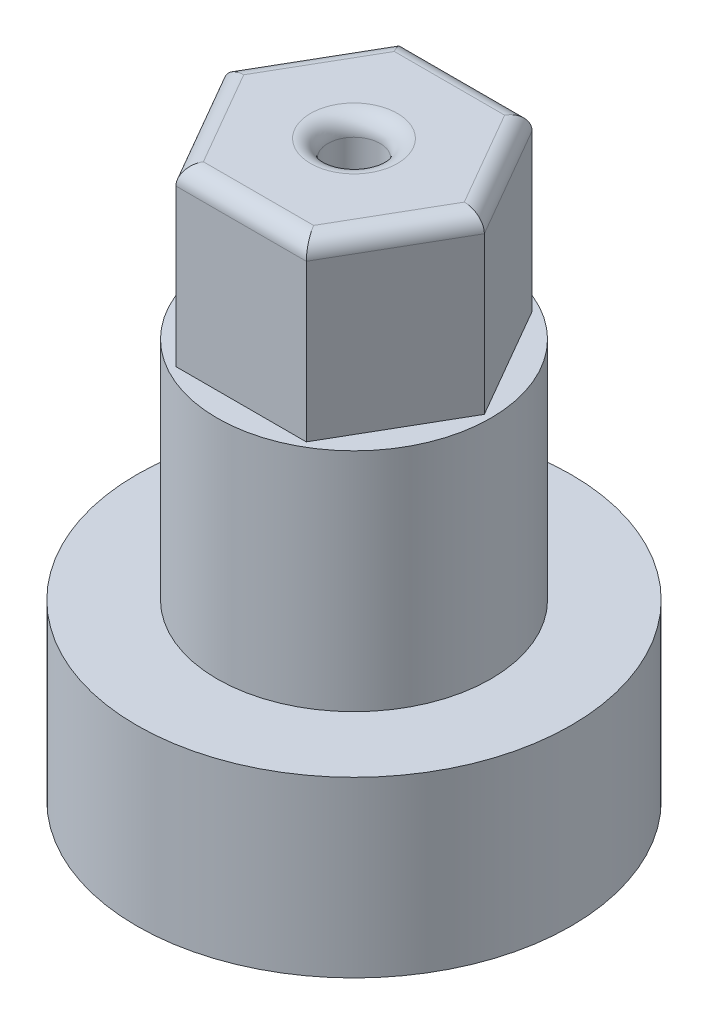
ISO-10303-21;
HEADER;
FILE_DESCRIPTION(('STEP AP214'),'2;1');
FILE_NAME('part.step','',(''),(''),'','','');
FILE_SCHEMA(('AUTOMOTIVE_DESIGN { 1 0 10303 214 1 1 1 1 }'));
ENDSEC;
DATA;
#1=APPLICATION_CONTEXT('core data for automotive mechanical design processes');
#2=APPLICATION_PROTOCOL_DEFINITION('international standard','automotive_design',2000,#1);
#3=PRODUCT_CONTEXT('',#1,'mechanical');
#4=PRODUCT('Part','Part','',(#3));
#5=PRODUCT_RELATED_PRODUCT_CATEGORY('part','',(#4));
#6=PRODUCT_DEFINITION_FORMATION('','',#4);
#7=PRODUCT_DEFINITION_CONTEXT('part definition',#1,'design');
#8=PRODUCT_DEFINITION('design','',#6,#7);
#9=PRODUCT_DEFINITION_SHAPE('','',#8);
#10=(LENGTH_UNIT() NAMED_UNIT(*) SI_UNIT(.MILLI.,.METRE.));
#11=(NAMED_UNIT(*) PLANE_ANGLE_UNIT() SI_UNIT($,.RADIAN.));
#12=(NAMED_UNIT(*) SI_UNIT($,.STERADIAN.) SOLID_ANGLE_UNIT());
#13=UNCERTAINTY_MEASURE_WITH_UNIT(LENGTH_MEASURE(1.E-05),#10,'distance_accuracy_value','');
#14=(GEOMETRIC_REPRESENTATION_CONTEXT(3) GLOBAL_UNCERTAINTY_ASSIGNED_CONTEXT((#13)) GLOBAL_UNIT_ASSIGNED_CONTEXT((#10,
#11,#12)) REPRESENTATION_CONTEXT('',''));
#15=CARTESIAN_POINT('',(0.,0.,0.));
#16=DIRECTION('',(0.,0.,1.));
#17=DIRECTION('',(1.,0.,0.));
#18=AXIS2_PLACEMENT_3D('',#15,#16,#17);
#19=CARTESIAN_POINT('',(0.,10.,0.));
#20=DIRECTION('',(0.,1.,0.));
#21=DIRECTION('',(0.,0.,1.));
#22=AXIS2_PLACEMENT_3D('',#19,#20,#21);
#23=PLANE('',#22);
#24=CARTESIAN_POINT('',(0.,10.,0.));
#25=DIRECTION('',(0.,1.,0.));
#26=DIRECTION('',(0.,0.,1.));
#27=AXIS2_PLACEMENT_3D('',#24,#25,#26);
#28=CIRCLE('',#27,7.875);
#29=CARTESIAN_POINT('',(0.,10.,-7.875));
#30=VERTEX_POINT('',#29);
#31=EDGE_CURVE('E148',#30,#30,#28,.T.);
#32=ORIENTED_EDGE('',*,*,#31,.F.);
#33=EDGE_LOOP('',(#32));
#34=FACE_BOUND('',#33,.T.);
#35=CARTESIAN_POINT('',(0.,10.,0.));
#36=DIRECTION('',(0.,1.,0.));
#37=DIRECTION('',(0.,0.,1.));
#38=AXIS2_PLACEMENT_3D('',#35,#36,#37);
#39=CIRCLE('',#38,12.5);
#40=CARTESIAN_POINT('',(0.,10.,12.5));
#41=VERTEX_POINT('',#40);
#42=EDGE_CURVE('E179',#41,#41,#39,.T.);
#43=ORIENTED_EDGE('',*,*,#42,.T.);
#44=EDGE_LOOP('',(#43));
#45=FACE_BOUND('',#44,.T.);
#46=ADVANCED_FACE('F33',(#34,#45),#23,.T.);
#47=CARTESIAN_POINT('',(0.,0.,0.));
#48=DIRECTION('',(0.,1.,0.));
#49=DIRECTION('',(0.,0.,1.));
#50=AXIS2_PLACEMENT_3D('',#47,#48,#49);
#51=PLANE('',#50);
#52=CARTESIAN_POINT('',(0.,0.,0.));
#53=DIRECTION('',(0.,1.,0.));
#54=DIRECTION('',(0.,0.,1.));
#55=AXIS2_PLACEMENT_3D('',#52,#53,#54);
#56=CIRCLE('',#55,1.5);
#57=CARTESIAN_POINT('',(0.,0.,1.5));
#58=VERTEX_POINT('',#57);
#59=EDGE_CURVE('E129',#58,#58,#56,.T.);
#60=ORIENTED_EDGE('',*,*,#59,.T.);
#61=EDGE_LOOP('',(#60));
#62=FACE_BOUND('',#61,.T.);
#63=CARTESIAN_POINT('',(0.,0.,0.));
#64=DIRECTION('',(0.,1.,0.));
#65=DIRECTION('',(0.,0.,1.));
#66=AXIS2_PLACEMENT_3D('',#63,#64,#65);
#67=CIRCLE('',#66,12.5);
#68=CARTESIAN_POINT('',(0.,0.,12.5));
#69=VERTEX_POINT('',#68);
#70=EDGE_CURVE('E178',#69,#69,#67,.T.);
#71=ORIENTED_EDGE('',*,*,#70,.F.);
#72=EDGE_LOOP('',(#71));
#73=FACE_BOUND('',#72,.T.);
#74=CARTESIAN_POINT('',(7.,0.,0.));
#75=DIRECTION('',(0.,1.,0.));
#76=DIRECTION('',(0.,0.,1.));
#77=AXIS2_PLACEMENT_3D('',#74,#75,#76);
#78=CIRCLE('',#77,0.750000000000001);
#79=CARTESIAN_POINT('',(7.,0.,0.750000000000001));
#80=VERTEX_POINT('',#79);
#81=EDGE_CURVE('E175',#80,#80,#78,.T.);
#82=ORIENTED_EDGE('',*,*,#81,.T.);
#83=EDGE_LOOP('',(#82));
#84=FACE_BOUND('',#83,.T.);
#85=CARTESIAN_POINT('',(0.,0.,7.));
#86=DIRECTION('',(0.,1.,0.));
#87=DIRECTION('',(0.,0.,1.));
#88=AXIS2_PLACEMENT_3D('',#85,#86,#87);
#89=CIRCLE('',#88,0.750000000000001);
#90=CARTESIAN_POINT('',(0.,0.,7.75));
#91=VERTEX_POINT('',#90);
#92=EDGE_CURVE('E172',#91,#91,#89,.T.);
#93=ORIENTED_EDGE('',*,*,#92,.T.);
#94=EDGE_LOOP('',(#93));
#95=FACE_BOUND('',#94,.T.);
#96=CARTESIAN_POINT('',(-7.,0.,0.));
#97=DIRECTION('',(0.,1.,0.));
#98=DIRECTION('',(0.,0.,1.));
#99=AXIS2_PLACEMENT_3D('',#96,#97,#98);
#100=CIRCLE('',#99,0.750000000000001);
#101=CARTESIAN_POINT('',(-7.,0.,0.749999999999952));
#102=VERTEX_POINT('',#101);
#103=EDGE_CURVE('E169',#102,#102,#100,.T.);
#104=ORIENTED_EDGE('',*,*,#103,.T.);
#105=EDGE_LOOP('',(#104));
#106=FACE_BOUND('',#105,.T.);
#107=CARTESIAN_POINT('',(0.,0.,-7.));
#108=DIRECTION('',(0.,1.,0.));
#109=DIRECTION('',(0.,0.,1.));
#110=AXIS2_PLACEMENT_3D('',#107,#108,#109);
#111=CIRCLE('',#110,0.750000000000002);
#112=CARTESIAN_POINT('',(0.,0.,-6.25));
#113=VERTEX_POINT('',#112);
#114=EDGE_CURVE('E166',#113,#113,#111,.T.);
#115=ORIENTED_EDGE('',*,*,#114,.T.);
#116=EDGE_LOOP('',(#115));
#117=FACE_BOUND('',#116,.T.);
#118=ADVANCED_FACE('F231',(#62,#73,#84,#95,#106,#117),#51,.F.);
#119=CARTESIAN_POINT('',(0.,10.,0.));
#120=DIRECTION('',(0.,-1.,0.));
#121=DIRECTION('',(0.,0.,-1.));
#122=AXIS2_PLACEMENT_3D('',#119,#120,#121);
#123=CYLINDRICAL_SURFACE('',#122,12.5);
#124=ORIENTED_EDGE('',*,*,#42,.F.);
#125=EDGE_LOOP('',(#124));
#126=FACE_BOUND('',#125,.T.);
#127=ORIENTED_EDGE('',*,*,#70,.T.);
#128=EDGE_LOOP('',(#127));
#129=FACE_BOUND('',#128,.T.);
#130=ADVANCED_FACE('F255',(#126,#129),#123,.T.);
#131=CARTESIAN_POINT('',(7.,10.,0.));
#132=DIRECTION('',(0.,-1.,0.));
#133=DIRECTION('',(0.,0.,-1.));
#134=AXIS2_PLACEMENT_3D('',#131,#132,#133);
#135=CYLINDRICAL_SURFACE('',#134,0.750000000000001);
#136=CARTESIAN_POINT('',(7.,10.,0.));
#137=DIRECTION('',(0.,1.,0.));
#138=DIRECTION('',(0.,0.,1.));
#139=AXIS2_PLACEMENT_3D('',#136,#137,#138);
#140=CIRCLE('',#139,0.750000000000001);
#141=CARTESIAN_POINT('',(7.,10.,0.750000000000001));
#142=VERTEX_POINT('',#141);
#143=EDGE_CURVE('E163',#142,#142,#140,.T.);
#144=ORIENTED_EDGE('',*,*,#143,.T.);
#145=EDGE_LOOP('',(#144));
#146=FACE_BOUND('',#145,.T.);
#147=ORIENTED_EDGE('',*,*,#81,.F.);
#148=EDGE_LOOP('',(#147));
#149=FACE_BOUND('',#148,.T.);
#150=ADVANCED_FACE('F260',(#146,#149),#135,.F.);
#151=CARTESIAN_POINT('',(0.,10.,7.));
#152=DIRECTION('',(0.,-1.,0.));
#153=DIRECTION('',(0.,0.,-1.));
#154=AXIS2_PLACEMENT_3D('',#151,#152,#153);
#155=CYLINDRICAL_SURFACE('',#154,0.750000000000001);
#156=CARTESIAN_POINT('',(0.,10.,7.));
#157=DIRECTION('',(0.,1.,0.));
#158=DIRECTION('',(0.,0.,1.));
#159=AXIS2_PLACEMENT_3D('',#156,#157,#158);
#160=CIRCLE('',#159,0.750000000000001);
#161=CARTESIAN_POINT('',(0.,10.,7.75));
#162=VERTEX_POINT('',#161);
#163=EDGE_CURVE('E160',#162,#162,#160,.T.);
#164=ORIENTED_EDGE('',*,*,#163,.T.);
#165=EDGE_LOOP('',(#164));
#166=FACE_BOUND('',#165,.T.);
#167=ORIENTED_EDGE('',*,*,#92,.F.);
#168=EDGE_LOOP('',(#167));
#169=FACE_BOUND('',#168,.T.);
#170=ADVANCED_FACE('F450',(#166,#169),#155,.F.);
#171=CARTESIAN_POINT('',(-7.,10.,0.));
#172=DIRECTION('',(0.,-1.,0.));
#173=DIRECTION('',(0.,0.,-1.));
#174=AXIS2_PLACEMENT_3D('',#171,#172,#173);
#175=CYLINDRICAL_SURFACE('',#174,0.750000000000001);
#176=CARTESIAN_POINT('',(-7.,10.,0.));
#177=DIRECTION('',(0.,1.,0.));
#178=DIRECTION('',(0.,0.,1.));
#179=AXIS2_PLACEMENT_3D('',#176,#177,#178);
#180=CIRCLE('',#179,0.750000000000001);
#181=CARTESIAN_POINT('',(-7.,10.,0.749999999999952));
#182=VERTEX_POINT('',#181);
#183=EDGE_CURVE('E157',#182,#182,#180,.T.);
#184=ORIENTED_EDGE('',*,*,#183,.T.);
#185=EDGE_LOOP('',(#184));
#186=FACE_BOUND('',#185,.T.);
#187=ORIENTED_EDGE('',*,*,#103,.F.);
#188=EDGE_LOOP('',(#187));
#189=FACE_BOUND('',#188,.T.);
#190=ADVANCED_FACE('F441',(#186,#189),#175,.F.);
#191=CARTESIAN_POINT('',(0.,10.,-7.));
#192=DIRECTION('',(0.,-1.,0.));
#193=DIRECTION('',(0.,0.,-1.));
#194=AXIS2_PLACEMENT_3D('',#191,#192,#193);
#195=CYLINDRICAL_SURFACE('',#194,0.750000000000002);
#196=CARTESIAN_POINT('',(0.,10.,-7.));
#197=DIRECTION('',(0.,1.,0.));
#198=DIRECTION('',(0.,0.,1.));
#199=AXIS2_PLACEMENT_3D('',#196,#197,#198);
#200=CIRCLE('',#199,0.750000000000002);
#201=CARTESIAN_POINT('',(0.,10.,-6.25));
#202=VERTEX_POINT('',#201);
#203=EDGE_CURVE('E152',#202,#202,#200,.T.);
#204=ORIENTED_EDGE('',*,*,#203,.T.);
#205=EDGE_LOOP('',(#204));
#206=FACE_BOUND('',#205,.T.);
#207=ORIENTED_EDGE('',*,*,#114,.F.);
#208=EDGE_LOOP('',(#207));
#209=FACE_BOUND('',#208,.T.);
#210=ADVANCED_FACE('F433',(#206,#209),#195,.F.);
#211=CARTESIAN_POINT('',(0.,10.,0.));
#212=DIRECTION('',(0.,1.,0.));
#213=DIRECTION('',(0.,0.,1.));
#214=AXIS2_PLACEMENT_3D('',#211,#212,#213);
#215=PLANE('',#214);
#216=ORIENTED_EDGE('',*,*,#203,.F.);
#217=EDGE_LOOP('',(#216));
#218=FACE_BOUND('',#217,.T.);
#219=ADVANCED_FACE('F411',(#218),#215,.F.);
#220=ORIENTED_EDGE('',*,*,#183,.F.);
#221=EDGE_LOOP('',(#220));
#222=FACE_BOUND('',#221,.T.);
#223=ADVANCED_FACE('F418',(#222),#215,.F.);
#224=ORIENTED_EDGE('',*,*,#163,.F.);
#225=EDGE_LOOP('',(#224));
#226=FACE_BOUND('',#225,.T.);
#227=ADVANCED_FACE('F408',(#226),#215,.F.);
#228=ORIENTED_EDGE('',*,*,#143,.F.);
#229=EDGE_LOOP('',(#228));
#230=FACE_BOUND('',#229,.T.);
#231=ADVANCED_FACE('F399',(#230),#215,.F.);
#232=CARTESIAN_POINT('',(0.,23.,0.));
#233=DIRECTION('',(0.,-1.,0.));
#234=DIRECTION('',(0.,0.,-1.));
#235=AXIS2_PLACEMENT_3D('',#232,#233,#234);
#236=CYLINDRICAL_SURFACE('',#235,7.875);
#237=CARTESIAN_POINT('',(0.,23.,0.));
#238=DIRECTION('',(0.,1.,0.));
#239=DIRECTION('',(0.,0.,1.));
#240=AXIS2_PLACEMENT_3D('',#237,#238,#239);
#241=CIRCLE('',#240,7.875);
#242=CARTESIAN_POINT('',(0.,23.,-7.875));
#243=VERTEX_POINT('',#242);
#244=EDGE_CURVE('E149',#243,#243,#241,.T.);
#245=CARTESIAN_POINT('',(0.,23.,-7.875));
#246=CARTESIAN_POINT('',(0.,22.8645833333333,-7.875));
#247=CARTESIAN_POINT('',(0.,22.7291666666667,-7.875));
#248=CARTESIAN_POINT('',(0.,22.4583333333333,-7.875));
#249=CARTESIAN_POINT('',(0.,22.3229166666667,-7.875));
#250=CARTESIAN_POINT('',(0.,22.0520833333333,-7.875));
#251=CARTESIAN_POINT('',(0.,21.9166666666667,-7.875));
#252=CARTESIAN_POINT('',(0.,21.6458333333333,-7.875));
#253=CARTESIAN_POINT('',(0.,21.5104166666667,-7.875));
#254=CARTESIAN_POINT('',(0.,21.2395833333333,-7.875));
#255=CARTESIAN_POINT('',(0.,21.1041666666667,-7.875));
#256=CARTESIAN_POINT('',(0.,20.8333333333333,-7.875));
#257=CARTESIAN_POINT('',(0.,20.6979166666667,-7.875));
#258=CARTESIAN_POINT('',(0.,20.4270833333333,-7.875));
#259=CARTESIAN_POINT('',(0.,20.2916666666667,-7.875));
#260=CARTESIAN_POINT('',(0.,20.0208333333333,-7.875));
#261=CARTESIAN_POINT('',(0.,19.8854166666667,-7.875));
#262=CARTESIAN_POINT('',(0.,19.6145833333333,-7.875));
#263=CARTESIAN_POINT('',(0.,19.4791666666667,-7.875));
#264=CARTESIAN_POINT('',(0.,19.2083333333333,-7.875));
#265=CARTESIAN_POINT('',(0.,19.0729166666667,-7.875));
#266=CARTESIAN_POINT('',(0.,18.8020833333333,-7.875));
#267=CARTESIAN_POINT('',(0.,18.6666666666667,-7.875));
#268=CARTESIAN_POINT('',(0.,18.3958333333333,-7.875));
#269=CARTESIAN_POINT('',(0.,18.2604166666667,-7.875));
#270=CARTESIAN_POINT('',(0.,17.9895833333333,-7.875));
#271=CARTESIAN_POINT('',(0.,17.8541666666667,-7.875));
#272=CARTESIAN_POINT('',(0.,17.5833333333333,-7.875));
#273=CARTESIAN_POINT('',(0.,17.4479166666667,-7.875));
#274=CARTESIAN_POINT('',(0.,17.1770833333333,-7.875));
#275=CARTESIAN_POINT('',(0.,17.0416666666667,-7.875));
#276=CARTESIAN_POINT('',(0.,16.7708333333333,-7.875));
#277=CARTESIAN_POINT('',(0.,16.6354166666667,-7.875));
#278=CARTESIAN_POINT('',(0.,16.3645833333333,-7.875));
#279=CARTESIAN_POINT('',(0.,16.2291666666667,-7.875));
#280=CARTESIAN_POINT('',(0.,15.9583333333333,-7.875));
#281=CARTESIAN_POINT('',(0.,15.8229166666667,-7.875));
#282=CARTESIAN_POINT('',(0.,15.5520833333333,-7.875));
#283=CARTESIAN_POINT('',(0.,15.4166666666667,-7.875));
#284=CARTESIAN_POINT('',(0.,15.1458333333333,-7.875));
#285=CARTESIAN_POINT('',(0.,15.0104166666667,-7.875));
#286=CARTESIAN_POINT('',(0.,14.7395833333333,-7.875));
#287=CARTESIAN_POINT('',(0.,14.6041666666667,-7.875));
#288=CARTESIAN_POINT('',(0.,14.3333333333333,-7.875));
#289=CARTESIAN_POINT('',(0.,14.1979166666667,-7.875));
#290=CARTESIAN_POINT('',(0.,13.9270833333333,-7.875));
#291=CARTESIAN_POINT('',(0.,13.7916666666667,-7.875));
#292=CARTESIAN_POINT('',(0.,13.5208333333333,-7.875));
#293=CARTESIAN_POINT('',(0.,13.3854166666667,-7.875));
#294=CARTESIAN_POINT('',(0.,13.1145833333333,-7.875));
#295=CARTESIAN_POINT('',(0.,12.9791666666667,-7.875));
#296=CARTESIAN_POINT('',(0.,12.7083333333333,-7.875));
#297=CARTESIAN_POINT('',(0.,12.5729166666667,-7.875));
#298=CARTESIAN_POINT('',(0.,12.3020833333333,-7.875));
#299=CARTESIAN_POINT('',(0.,12.1666666666667,-7.875));
#300=CARTESIAN_POINT('',(0.,11.8958333333333,-7.875));
#301=CARTESIAN_POINT('',(0.,11.7604166666667,-7.875));
#302=CARTESIAN_POINT('',(0.,11.4895833333333,-7.875));
#303=CARTESIAN_POINT('',(0.,11.3541666666667,-7.875));
#304=CARTESIAN_POINT('',(0.,11.0833333333333,-7.875));
#305=CARTESIAN_POINT('',(0.,10.9479166666667,-7.875));
#306=CARTESIAN_POINT('',(0.,10.6770833333333,-7.875));
#307=CARTESIAN_POINT('',(0.,10.5416666666667,-7.875));
#308=CARTESIAN_POINT('',(0.,10.2708333333333,-7.875));
#309=CARTESIAN_POINT('',(0.,10.1354166666667,-7.875));
#310=CARTESIAN_POINT('',(0.,10.,-7.875));
#311=B_SPLINE_CURVE_WITH_KNOTS('',3,(#245,#246,#247,#248,#249,#250,#251,#252,#253,#254,#255,
#256,#257,#258,#259,#260,#261,#262,#263,#264,#265,#266,#267,#268,#269,#270,#271,#272,#273,#274,
#275,#276,#277,#278,#279,#280,#281,#282,#283,#284,#285,#286,#287,#288,#289,#290,#291,#292,#293,
#294,#295,#296,#297,#298,#299,#300,#301,#302,#303,#304,#305,#306,#307,#308,#309,#310),
.UNSPECIFIED.,.F.,.F.,(4,2,2,2,2,2,2,2,2,2,2,2,2,2,2,2,2,2,2,2,2,2,2,2,2,2,2,2,2,2,2,2,4),(0.,
0.40625,0.812500000000001,1.21875,1.625,2.03125,2.4375,2.84375,3.25,3.65625,4.0625,4.46875,
4.875,5.28125,5.6875,6.09375,6.5,6.90625,7.3125,7.71875,8.125,8.53125,8.9375,9.34375,9.75,
10.15625,10.5625,10.96875,11.375,11.78125,12.1875,12.59375,13.),.UNSPECIFIED.);
#312=EDGE_CURVE('BSEAM391',#243,#30,#311,.T.);
#313=ORIENTED_EDGE('',*,*,#244,.F.);
#314=ORIENTED_EDGE('',*,*,#31,.T.);
#315=ORIENTED_EDGE('',*,*,#312,.T.);
#316=ORIENTED_EDGE('',*,*,#312,.F.);
#317=EDGE_LOOP('',(#313,#315,#314,#316));
#318=FACE_BOUND('',#317,.T.);
#319=ADVANCED_FACE('F391',(#318),#236,.T.);
#320=CARTESIAN_POINT('',(0.,23.,0.));
#321=DIRECTION('',(0.,1.,0.));
#322=DIRECTION('',(0.,0.,1.));
#323=AXIS2_PLACEMENT_3D('',#320,#321,#322);
#324=PLANE('',#323);
#325=DIRECTION('',(0.499999999999995,0.,-0.866025403784441));
#326=VECTOR('',#325,1.);
#327=CARTESIAN_POINT('',(3.75000000000008,23.,6.49519052838325));
#328=LINE('',#327,#326);
#329=CARTESIAN_POINT('',(3.75000000000008,23.,6.49519052838325));
#330=VERTEX_POINT('',#329);
#331=CARTESIAN_POINT('',(7.5,23.,0.));
#332=VERTEX_POINT('',#331);
#333=EDGE_CURVE('E127',#330,#332,#328,.T.);
#334=ORIENTED_EDGE('',*,*,#333,.F.);
#335=DIRECTION('',(1.,0.,0.));
#336=VECTOR('',#335,1.);
#337=CARTESIAN_POINT('',(-3.74999999999994,23.,6.49519052838332));
#338=LINE('',#337,#336);
#339=CARTESIAN_POINT('',(-3.74999999999994,23.,6.49519052838332));
#340=VERTEX_POINT('',#339);
#341=EDGE_CURVE('E137',#340,#330,#338,.T.);
#342=ORIENTED_EDGE('',*,*,#341,.F.);
#343=DIRECTION('',(0.500000000000007,0.,0.866025403784435));
#344=VECTOR('',#343,1.);
#345=CARTESIAN_POINT('',(-7.5,23.,0.));
#346=LINE('',#345,#344);
#347=CARTESIAN_POINT('',(-7.5,23.,0.));
#348=VERTEX_POINT('',#347);
#349=EDGE_CURVE('E134',#348,#340,#346,.T.);
#350=ORIENTED_EDGE('',*,*,#349,.F.);
#351=DIRECTION('',(-0.499999999999995,0.,0.866025403784442));
#352=VECTOR('',#351,1.);
#353=CARTESIAN_POINT('',(-3.75000000000003,23.,-6.49519052838327));
#354=LINE('',#353,#352);
#355=CARTESIAN_POINT('',(-3.75000000000003,23.,-6.49519052838327));
#356=VERTEX_POINT('',#355);
#357=EDGE_CURVE('E124',#356,#348,#354,.T.);
#358=ORIENTED_EDGE('',*,*,#357,.F.);
#359=DIRECTION('',(-1.,0.,0.));
#360=VECTOR('',#359,1.);
#361=CARTESIAN_POINT('',(3.74999999999998,23.,-6.4951905283833));
#362=LINE('',#361,#360);
#363=CARTESIAN_POINT('',(3.74999999999998,23.,-6.4951905283833));
#364=VERTEX_POINT('',#363);
#365=EDGE_CURVE('E108',#364,#356,#362,.T.);
#366=ORIENTED_EDGE('',*,*,#365,.F.);
#367=DIRECTION('',(-0.500000000000001,0.,-0.866025403784438));
#368=VECTOR('',#367,1.);
#369=CARTESIAN_POINT('',(7.5,23.,0.));
#370=LINE('',#369,#368);
#371=EDGE_CURVE('E120',#332,#364,#370,.T.);
#372=ORIENTED_EDGE('',*,*,#371,.F.);
#373=EDGE_LOOP('',(#334,#342,#350,#358,#366,#372));
#374=FACE_BOUND('',#373,.T.);
#375=ORIENTED_EDGE('',*,*,#244,.T.);
#376=EDGE_LOOP('',(#375));
#377=FACE_BOUND('',#376,.T.);
#378=ADVANCED_FACE('F118',(#374,#377),#324,.T.);
#379=CARTESIAN_POINT('',(3.75000000000008,33.,6.49519052838325));
#380=DIRECTION('',(-0.866025403784442,0.,-0.499999999999995));
#381=DIRECTION('',(-0.499999999999995,0.,0.866025403784442));
#382=AXIS2_PLACEMENT_3D('',#379,#380,#381);
#383=PLANE('',#382);
#384=DIRECTION('',(0.,-1.,0.));
#385=VECTOR('',#384,1.);
#386=CARTESIAN_POINT('',(7.5,33.,0.));
#387=LINE('',#386,#385);
#388=CARTESIAN_POINT('',(7.5,32.,0.));
#389=VERTEX_POINT('',#388);
#390=EDGE_CURVE('E111',#389,#332,#387,.T.);
#391=ORIENTED_EDGE('',*,*,#390,.F.);
#392=DIRECTION('',(0.499999999999995,0.,-0.866025403784442));
#393=VECTOR('',#392,1.);
#394=CARTESIAN_POINT('',(3.75000000000008,32.,6.49519052838325));
#395=LINE('',#394,#393);
#396=CARTESIAN_POINT('',(3.75000000000008,32.,6.49519052838325));
#397=VERTEX_POINT('',#396);
#398=EDGE_CURVE('E42',#389,#397,#395,.F.);
#399=ORIENTED_EDGE('',*,*,#398,.T.);
#400=DIRECTION('',(0.,-1.,0.));
#401=VECTOR('',#400,1.);
#402=CARTESIAN_POINT('',(3.75000000000008,33.,6.49519052838325));
#403=LINE('',#402,#401);
#404=EDGE_CURVE('E140',#397,#330,#403,.T.);
#405=ORIENTED_EDGE('',*,*,#404,.T.);
#406=ORIENTED_EDGE('',*,*,#333,.T.);
#407=EDGE_LOOP('',(#391,#399,#405,#406));
#408=FACE_BOUND('',#407,.T.);
#409=ADVANCED_FACE('F374',(#408),#383,.F.);
#410=CARTESIAN_POINT('',(7.5,33.,0.));
#411=DIRECTION('',(-0.866025403784438,0.,0.500000000000001));
#412=DIRECTION('',(0.500000000000001,0.,0.866025403784438));
#413=AXIS2_PLACEMENT_3D('',#410,#411,#412);
#414=PLANE('',#413);
#415=DIRECTION('',(0.,-1.,0.));
#416=VECTOR('',#415,1.);
#417=CARTESIAN_POINT('',(3.74999999999998,33.,-6.4951905283833));
#418=LINE('',#417,#416);
#419=CARTESIAN_POINT('',(3.74999999999998,32.,-6.4951905283833));
#420=VERTEX_POINT('',#419);
#421=EDGE_CURVE('E105',#420,#364,#418,.T.);
#422=ORIENTED_EDGE('',*,*,#421,.F.);
#423=DIRECTION('',(-0.500000000000001,0.,-0.866025403784438));
#424=VECTOR('',#423,1.);
#425=CARTESIAN_POINT('',(7.5,32.,0.));
#426=LINE('',#425,#424);
#427=EDGE_CURVE('E50',#420,#389,#426,.F.);
#428=ORIENTED_EDGE('',*,*,#427,.T.);
#429=ORIENTED_EDGE('',*,*,#390,.T.);
#430=ORIENTED_EDGE('',*,*,#371,.T.);
#431=EDGE_LOOP('',(#422,#428,#429,#430));
#432=FACE_BOUND('',#431,.T.);
#433=ADVANCED_FACE('F126',(#432),#414,.F.);
#434=CARTESIAN_POINT('',(3.74999999999998,33.,-6.4951905283833));
#435=DIRECTION('',(0.,0.,1.));
#436=DIRECTION('',(1.,0.,0.));
#437=AXIS2_PLACEMENT_3D('',#434,#435,#436);
#438=PLANE('',#437);
#439=DIRECTION('',(0.,-1.,0.));
#440=VECTOR('',#439,1.);
#441=CARTESIAN_POINT('',(-3.75000000000003,33.,-6.49519052838327));
#442=LINE('',#441,#440);
#443=CARTESIAN_POINT('',(-3.75000000000003,32.,-6.49519052838327));
#444=VERTEX_POINT('',#443);
#445=EDGE_CURVE('E112',#444,#356,#442,.T.);
#446=ORIENTED_EDGE('',*,*,#445,.F.);
#447=DIRECTION('',(-1.,0.,0.));
#448=VECTOR('',#447,1.);
#449=CARTESIAN_POINT('',(3.74999999999998,32.,-6.4951905283833));
#450=LINE('',#449,#448);
#451=EDGE_CURVE('E58',#444,#420,#450,.F.);
#452=ORIENTED_EDGE('',*,*,#451,.T.);
#453=ORIENTED_EDGE('',*,*,#421,.T.);
#454=ORIENTED_EDGE('',*,*,#365,.T.);
#455=EDGE_LOOP('',(#446,#452,#453,#454));
#456=FACE_BOUND('',#455,.T.);
#457=ADVANCED_FACE('F107',(#456),#438,.F.);
#458=CARTESIAN_POINT('',(-3.75000000000003,33.,-6.49519052838327));
#459=DIRECTION('',(0.866025403784442,0.,0.499999999999995));
#460=DIRECTION('',(0.499999999999995,0.,-0.866025403784442));
#461=AXIS2_PLACEMENT_3D('',#458,#459,#460);
#462=PLANE('',#461);
#463=DIRECTION('',(0.,-1.,0.));
#464=VECTOR('',#463,1.);
#465=CARTESIAN_POINT('',(-7.5,33.,0.));
#466=LINE('',#465,#464);
#467=CARTESIAN_POINT('',(-7.5,32.,0.));
#468=VERTEX_POINT('',#467);
#469=EDGE_CURVE('E144',#468,#348,#466,.T.);
#470=ORIENTED_EDGE('',*,*,#469,.F.);
#471=DIRECTION('',(-0.499999999999995,0.,0.866025403784442));
#472=VECTOR('',#471,1.);
#473=CARTESIAN_POINT('',(-3.75000000000003,32.,-6.49519052838327));
#474=LINE('',#473,#472);
#475=EDGE_CURVE('E205',#468,#444,#474,.F.);
#476=ORIENTED_EDGE('',*,*,#475,.T.);
#477=ORIENTED_EDGE('',*,*,#445,.T.);
#478=ORIENTED_EDGE('',*,*,#357,.T.);
#479=EDGE_LOOP('',(#470,#476,#477,#478));
#480=FACE_BOUND('',#479,.T.);
#481=ADVANCED_FACE('F350',(#480),#462,.F.);
#482=CARTESIAN_POINT('',(-7.5,33.,0.));
#483=DIRECTION('',(0.866025403784434,0.,-0.500000000000007));
#484=DIRECTION('',(-0.500000000000007,0.,-0.866025403784435));
#485=AXIS2_PLACEMENT_3D('',#482,#483,#484);
#486=PLANE('',#485);
#487=DIRECTION('',(0.,-1.,0.));
#488=VECTOR('',#487,1.);
#489=CARTESIAN_POINT('',(-3.74999999999994,33.,6.49519052838332));
#490=LINE('',#489,#488);
#491=CARTESIAN_POINT('',(-3.74999999999994,32.,6.49519052838332));
#492=VERTEX_POINT('',#491);
#493=EDGE_CURVE('E142',#492,#340,#490,.T.);
#494=ORIENTED_EDGE('',*,*,#493,.F.);
#495=DIRECTION('',(0.500000000000007,0.,0.866025403784435));
#496=VECTOR('',#495,1.);
#497=CARTESIAN_POINT('',(-7.5,32.,0.));
#498=LINE('',#497,#496);
#499=EDGE_CURVE('E203',#492,#468,#498,.F.);
#500=ORIENTED_EDGE('',*,*,#499,.T.);
#501=ORIENTED_EDGE('',*,*,#469,.T.);
#502=ORIENTED_EDGE('',*,*,#349,.T.);
#503=EDGE_LOOP('',(#494,#500,#501,#502));
#504=FACE_BOUND('',#503,.T.);
#505=ADVANCED_FACE('F341',(#504),#486,.F.);
#506=CARTESIAN_POINT('',(-3.74999999999994,33.,6.49519052838332));
#507=DIRECTION('',(0.,0.,-1.));
#508=DIRECTION('',(-1.,0.,0.));
#509=AXIS2_PLACEMENT_3D('',#506,#507,#508);
#510=PLANE('',#509);
#511=ORIENTED_EDGE('',*,*,#404,.F.);
#512=DIRECTION('',(1.,0.,0.));
#513=VECTOR('',#512,1.);
#514=CARTESIAN_POINT('',(-3.74999999999994,32.,6.49519052838332));
#515=LINE('',#514,#513);
#516=EDGE_CURVE('E200',#397,#492,#515,.F.);
#517=ORIENTED_EDGE('',*,*,#516,.T.);
#518=ORIENTED_EDGE('',*,*,#493,.T.);
#519=ORIENTED_EDGE('',*,*,#341,.T.);
#520=EDGE_LOOP('',(#511,#517,#518,#519));
#521=FACE_BOUND('',#520,.T.);
#522=ADVANCED_FACE('F246',(#521),#510,.F.);
#523=CARTESIAN_POINT('',(0.,33.,0.));
#524=DIRECTION('',(0.,1.,0.));
#525=DIRECTION('',(0.,0.,1.));
#526=AXIS2_PLACEMENT_3D('',#523,#524,#525);
#527=PLANE('',#526);
#528=DIRECTION('',(0.500000000000007,0.,0.866025403784435));
#529=VECTOR('',#528,1.);
#530=CARTESIAN_POINT('',(-2.8839745962155,33.,5.99519052838332));
#531=LINE('',#530,#529);
#532=CARTESIAN_POINT('',(-6.34529946162075,33.,0.));
#533=VERTEX_POINT('',#532);
#534=CARTESIAN_POINT('',(-3.17264973081032,33.,5.49519052838332));
#535=VERTEX_POINT('',#534);
#536=EDGE_CURVE('E195',#533,#535,#531,.T.);
#537=ORIENTED_EDGE('',*,*,#536,.T.);
#538=DIRECTION('',(1.,0.,0.));
#539=VECTOR('',#538,1.);
#540=CARTESIAN_POINT('',(3.75000000000007,33.,5.49519052838325));
#541=LINE('',#540,#539);
#542=CARTESIAN_POINT('',(3.17264973081044,33.,5.49519052838325));
#543=VERTEX_POINT('',#542);
#544=EDGE_CURVE('E197',#535,#543,#541,.T.);
#545=ORIENTED_EDGE('',*,*,#544,.T.);
#546=DIRECTION('',(0.499999999999995,0.,-0.866025403784442));
#547=VECTOR('',#546,1.);
#548=CARTESIAN_POINT('',(6.63397459621556,33.,-0.499999999999995));
#549=LINE('',#548,#547);
#550=CARTESIAN_POINT('',(6.34529946162075,33.,0.));
#551=VERTEX_POINT('',#550);
#552=EDGE_CURVE('E187',#543,#551,#549,.T.);
#553=ORIENTED_EDGE('',*,*,#552,.T.);
#554=DIRECTION('',(-0.500000000000001,0.,-0.866025403784438));
#555=VECTOR('',#554,1.);
#556=CARTESIAN_POINT('',(2.88397459621555,33.,-5.9951905283833));
#557=LINE('',#556,#555);
#558=CARTESIAN_POINT('',(3.17264973081036,33.,-5.4951905283833));
#559=VERTEX_POINT('',#558);
#560=EDGE_CURVE('E189',#551,#559,#557,.T.);
#561=ORIENTED_EDGE('',*,*,#560,.T.);
#562=DIRECTION('',(-1.,0.,0.));
#563=VECTOR('',#562,1.);
#564=CARTESIAN_POINT('',(-3.75000000000003,33.,-5.49519052838327));
#565=LINE('',#564,#563);
#566=CARTESIAN_POINT('',(-3.1726497308104,33.,-5.49519052838327));
#567=VERTEX_POINT('',#566);
#568=EDGE_CURVE('E191',#559,#567,#565,.T.);
#569=ORIENTED_EDGE('',*,*,#568,.T.);
#570=DIRECTION('',(-0.499999999999995,0.,0.866025403784442));
#571=VECTOR('',#570,1.);
#572=CARTESIAN_POINT('',(-6.63397459621556,33.,0.500000000000048));
#573=LINE('',#572,#571);
#574=EDGE_CURVE('E193',#567,#533,#573,.T.);
#575=ORIENTED_EDGE('',*,*,#574,.T.);
#576=EDGE_LOOP('',(#537,#545,#553,#561,#569,#575));
#577=FACE_BOUND('',#576,.T.);
#578=CARTESIAN_POINT('',(0.,33.,0.));
#579=DIRECTION('',(0.,1.,0.));
#580=DIRECTION('',(0.,0.,1.));
#581=AXIS2_PLACEMENT_3D('',#578,#579,#580);
#582=CIRCLE('',#581,2.5);
#583=CARTESIAN_POINT('',(0.,33.,2.5));
#584=VERTEX_POINT('',#583);
#585=EDGE_CURVE('E182',#584,#584,#582,.F.);
#586=ORIENTED_EDGE('',*,*,#585,.T.);
#587=EDGE_LOOP('',(#586));
#588=FACE_BOUND('',#587,.T.);
#589=ADVANCED_FACE('F237',(#577,#588),#527,.T.);
#590=CARTESIAN_POINT('',(0.,0.,0.));
#591=DIRECTION('',(0.,1.,0.));
#592=DIRECTION('',(0.,0.,1.));
#593=AXIS2_PLACEMENT_3D('',#590,#591,#592);
#594=CYLINDRICAL_SURFACE('',#593,1.5);
#595=CARTESIAN_POINT('',(0.,32.,0.));
#596=DIRECTION('',(0.,1.,0.));
#597=DIRECTION('',(0.,0.,1.));
#598=AXIS2_PLACEMENT_3D('',#595,#596,#597);
#599=CIRCLE('',#598,1.5);
#600=CARTESIAN_POINT('',(0.,32.,1.5));
#601=VERTEX_POINT('',#600);
#602=EDGE_CURVE('E11',#601,#601,#599,.T.);
#603=ORIENTED_EDGE('',*,*,#602,.T.);
#604=EDGE_LOOP('',(#603));
#605=FACE_BOUND('',#604,.T.);
#606=ORIENTED_EDGE('',*,*,#59,.F.);
#607=EDGE_LOOP('',(#606));
#608=FACE_BOUND('',#607,.T.);
#609=ADVANCED_FACE('F234',(#605,#608),#594,.F.);
#610=CARTESIAN_POINT('',(0.,32.,-5.49519052838329));
#611=DIRECTION('',(1.,0.,0.));
#612=DIRECTION('',(0.,0.,-1.));
#613=AXIS2_PLACEMENT_3D('',#610,#611,#612);
#614=CYLINDRICAL_SURFACE('',#613,1.);
#615=CARTESIAN_POINT('',(3.17264973081036,32.,-5.4951905283833));
#616=DIRECTION('',(0.86602540378444,0.,0.499999999999998));
#617=DIRECTION('',(-0.499999999999998,0.,0.86602540378444));
#618=AXIS2_PLACEMENT_3D('',#615,#616,#617);
#619=ELLIPSE('',#618,1.15470053837925,1.);
#620=EDGE_CURVE('E219',#420,#559,#619,.T.);
#621=ORIENTED_EDGE('',*,*,#620,.F.);
#622=ORIENTED_EDGE('',*,*,#451,.F.);
#623=CARTESIAN_POINT('',(-3.1726497308104,32.,-5.49519052838327));
#624=DIRECTION('',(0.866025403784436,0.,-0.500000000000004));
#625=DIRECTION('',(0.500000000000004,0.,0.866025403784436));
#626=AXIS2_PLACEMENT_3D('',#623,#624,#625);
#627=ELLIPSE('',#626,1.15470053837925,1.);
#628=EDGE_CURVE('E37',#567,#444,#627,.F.);
#629=ORIENTED_EDGE('',*,*,#628,.F.);
#630=ORIENTED_EDGE('',*,*,#568,.F.);
#631=EDGE_LOOP('',(#621,#622,#629,#630));
#632=FACE_BOUND('',#631,.T.);
#633=ADVANCED_FACE('F236',(#632),#614,.T.);
#634=CARTESIAN_POINT('',(-4.75897459621557,32.,-2.74759526419161));
#635=DIRECTION('',(0.499999999999995,0.,-0.866025403784442));
#636=DIRECTION('',(-0.866025403784442,0.,-0.499999999999995));
#637=AXIS2_PLACEMENT_3D('',#634,#635,#636);
#638=CYLINDRICAL_SURFACE('',#637,1.);
#639=ORIENTED_EDGE('',*,*,#628,.T.);
#640=ORIENTED_EDGE('',*,*,#475,.F.);
#641=CARTESIAN_POINT('',(-6.34529946162075,32.,0.));
#642=DIRECTION('',(0.,0.,-1.));
#643=DIRECTION('',(1.,0.,0.));
#644=AXIS2_PLACEMENT_3D('',#641,#642,#643);
#645=ELLIPSE('',#644,1.15470053837925,1.);
#646=EDGE_CURVE('E217',#533,#468,#645,.F.);
#647=ORIENTED_EDGE('',*,*,#646,.F.);
#648=ORIENTED_EDGE('',*,*,#574,.F.);
#649=EDGE_LOOP('',(#639,#640,#647,#648));
#650=FACE_BOUND('',#649,.T.);
#651=ADVANCED_FACE('F244',(#650),#638,.T.);
#652=CARTESIAN_POINT('',(4.75897459621555,32.,-2.74759526419165));
#653=DIRECTION('',(0.500000000000001,0.,0.866025403784438));
#654=DIRECTION('',(0.866025403784438,0.,-0.500000000000001));
#655=AXIS2_PLACEMENT_3D('',#652,#653,#654);
#656=CYLINDRICAL_SURFACE('',#655,1.);
#657=ORIENTED_EDGE('',*,*,#620,.T.);
#658=ORIENTED_EDGE('',*,*,#560,.F.);
#659=CARTESIAN_POINT('',(6.34529946162075,32.,0.));
#660=DIRECTION('',(0.,0.,1.));
#661=DIRECTION('',(-1.,0.,0.));
#662=AXIS2_PLACEMENT_3D('',#659,#660,#661);
#663=ELLIPSE('',#662,1.15470053837925,1.);
#664=EDGE_CURVE('E214',#389,#551,#663,.T.);
#665=ORIENTED_EDGE('',*,*,#664,.F.);
#666=ORIENTED_EDGE('',*,*,#427,.F.);
#667=EDGE_LOOP('',(#657,#658,#665,#666));
#668=FACE_BOUND('',#667,.T.);
#669=ADVANCED_FACE('F277',(#668),#656,.T.);
#670=CARTESIAN_POINT('',(-4.75897459621553,32.,2.74759526419168));
#671=DIRECTION('',(-0.500000000000007,0.,-0.866025403784435));
#672=DIRECTION('',(-0.866025403784434,0.,0.500000000000007));
#673=AXIS2_PLACEMENT_3D('',#670,#671,#672);
#674=CYLINDRICAL_SURFACE('',#673,1.);
#675=ORIENTED_EDGE('',*,*,#646,.T.);
#676=ORIENTED_EDGE('',*,*,#499,.F.);
#677=CARTESIAN_POINT('',(-3.17264973081032,32.,5.49519052838332));
#678=DIRECTION('',(-0.866025403784443,0.,-0.499999999999992));
#679=DIRECTION('',(0.499999999999992,0.,-0.866025403784443));
#680=AXIS2_PLACEMENT_3D('',#677,#678,#679);
#681=ELLIPSE('',#680,1.15470053837925,1.);
#682=EDGE_CURVE('E212',#535,#492,#681,.F.);
#683=ORIENTED_EDGE('',*,*,#682,.F.);
#684=ORIENTED_EDGE('',*,*,#536,.F.);
#685=EDGE_LOOP('',(#675,#676,#683,#684));
#686=FACE_BOUND('',#685,.T.);
#687=ADVANCED_FACE('F273',(#686),#674,.T.);
#688=CARTESIAN_POINT('',(4.7589745962156,32.,2.74759526419163));
#689=DIRECTION('',(-0.499999999999995,0.,0.866025403784442));
#690=DIRECTION('',(0.866025403784442,0.,0.499999999999995));
#691=AXIS2_PLACEMENT_3D('',#688,#689,#690);
#692=CYLINDRICAL_SURFACE('',#691,1.);
#693=ORIENTED_EDGE('',*,*,#664,.T.);
#694=ORIENTED_EDGE('',*,*,#552,.F.);
#695=CARTESIAN_POINT('',(3.17264973081044,32.,5.49519052838325));
#696=DIRECTION('',(-0.866025403784434,0.,0.500000000000007));
#697=DIRECTION('',(0.500000000000007,0.,0.866025403784435));
#698=AXIS2_PLACEMENT_3D('',#695,#696,#697);
#699=ELLIPSE('',#698,1.15470053837925,1.);
#700=EDGE_CURVE('E210',#397,#543,#699,.T.);
#701=ORIENTED_EDGE('',*,*,#700,.F.);
#702=ORIENTED_EDGE('',*,*,#398,.F.);
#703=EDGE_LOOP('',(#693,#694,#701,#702));
#704=FACE_BOUND('',#703,.T.);
#705=ADVANCED_FACE('F269',(#704),#692,.T.);
#706=CARTESIAN_POINT('',(0.,32.,5.49519052838329));
#707=DIRECTION('',(-1.,0.,0.));
#708=DIRECTION('',(0.,0.,1.));
#709=AXIS2_PLACEMENT_3D('',#706,#707,#708);
#710=CYLINDRICAL_SURFACE('',#709,1.);
#711=ORIENTED_EDGE('',*,*,#682,.T.);
#712=ORIENTED_EDGE('',*,*,#516,.F.);
#713=ORIENTED_EDGE('',*,*,#700,.T.);
#714=ORIENTED_EDGE('',*,*,#544,.F.);
#715=EDGE_LOOP('',(#711,#712,#713,#714));
#716=FACE_BOUND('',#715,.T.);
#717=ADVANCED_FACE('F266',(#716),#710,.T.);
#718=CARTESIAN_POINT('',(0.,32.,0.));
#719=DIRECTION('',(0.,1.,0.));
#720=DIRECTION('',(0.,0.,1.));
#721=AXIS2_PLACEMENT_3D('',#718,#719,#720);
#722=TOROIDAL_SURFACE('',#721,2.5,1.);
#723=ORIENTED_EDGE('',*,*,#585,.F.);
#724=EDGE_LOOP('',(#723));
#725=FACE_BOUND('',#724,.T.);
#726=ORIENTED_EDGE('',*,*,#602,.F.);
#727=EDGE_LOOP('',(#726));
#728=FACE_BOUND('',#727,.T.);
#729=ADVANCED_FACE('F35',(#725,#728),#722,.T.);
#730=CLOSED_SHELL('',(#46,#118,#130,#150,#170,#190,#210,#219,#223,#227,#231,#319,#378,#409,#433,
#457,#481,#505,#522,#589,#609,#633,#651,#669,#687,#705,#717,#729));
#731=MANIFOLD_SOLID_BREP('B2',#730);
#732=ADVANCED_BREP_SHAPE_REPRESENTATION('',(#18,#731),#14);
#733=SHAPE_DEFINITION_REPRESENTATION(#9,#732);
ENDSEC;
END-ISO-10303-21;
